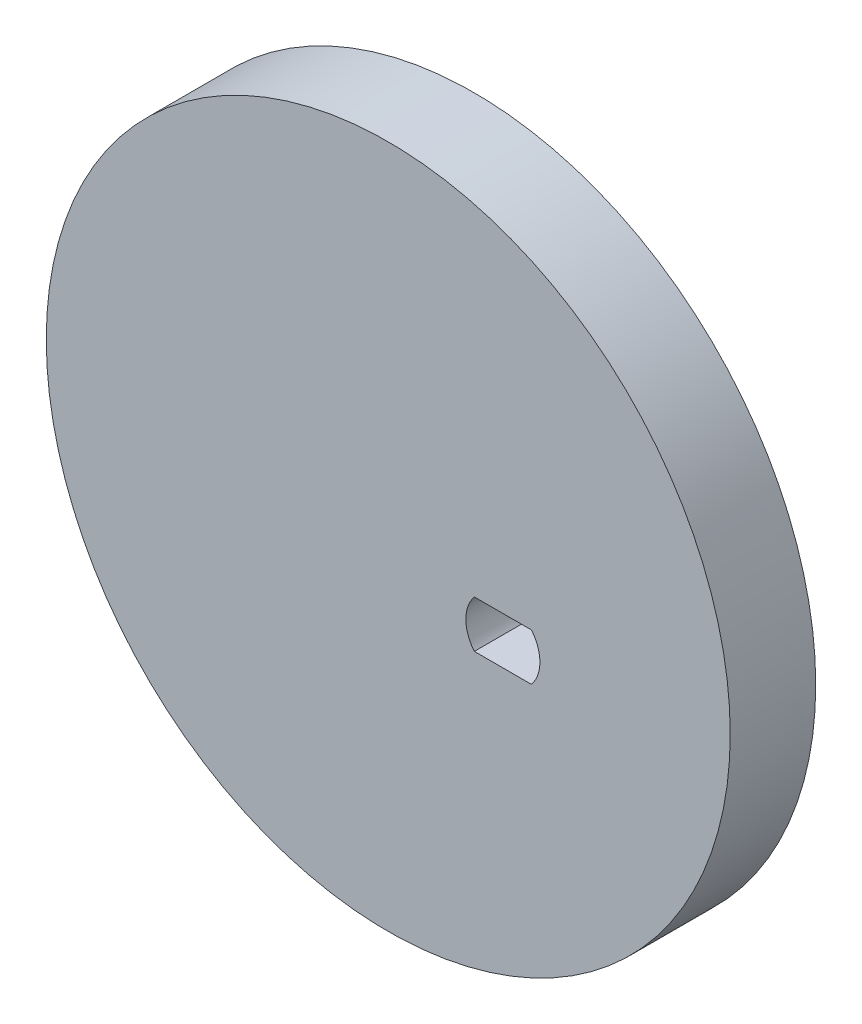
ISO-10303-21;
HEADER;
FILE_DESCRIPTION(('STEP AP214'),'2;1');
FILE_NAME('part.step','',(''),(''),'','','');
FILE_SCHEMA(('AUTOMOTIVE_DESIGN { 1 0 10303 214 1 1 1 1 }'));
ENDSEC;
DATA;
#1=APPLICATION_CONTEXT('core data for automotive mechanical design processes');
#2=APPLICATION_PROTOCOL_DEFINITION('international standard','automotive_design',2000,#1);
#3=PRODUCT_CONTEXT('',#1,'mechanical');
#4=PRODUCT('Part','Part','',(#3));
#5=PRODUCT_RELATED_PRODUCT_CATEGORY('part','',(#4));
#6=PRODUCT_DEFINITION_FORMATION('','',#4);
#7=PRODUCT_DEFINITION_CONTEXT('part definition',#1,'design');
#8=PRODUCT_DEFINITION('design','',#6,#7);
#9=PRODUCT_DEFINITION_SHAPE('','',#8);
#10=(LENGTH_UNIT() NAMED_UNIT(*) SI_UNIT(.MILLI.,.METRE.));
#11=(NAMED_UNIT(*) PLANE_ANGLE_UNIT() SI_UNIT($,.RADIAN.));
#12=(NAMED_UNIT(*) SI_UNIT($,.STERADIAN.) SOLID_ANGLE_UNIT());
#13=UNCERTAINTY_MEASURE_WITH_UNIT(LENGTH_MEASURE(1.E-05),#10,'distance_accuracy_value','');
#14=(GEOMETRIC_REPRESENTATION_CONTEXT(3) GLOBAL_UNCERTAINTY_ASSIGNED_CONTEXT((#13)) GLOBAL_UNIT_ASSIGNED_CONTEXT((#10,
#11,#12)) REPRESENTATION_CONTEXT('',''));
#15=CARTESIAN_POINT('',(0.,0.,0.));
#16=DIRECTION('',(0.,0.,1.));
#17=DIRECTION('',(1.,0.,0.));
#18=AXIS2_PLACEMENT_3D('',#15,#16,#17);
#19=CARTESIAN_POINT('',(-8.51465388188488,2.43047333481311,6.35));
#20=DIRECTION('',(0.,0.,1.));
#21=DIRECTION('',(1.,0.,0.));
#22=AXIS2_PLACEMENT_3D('',#19,#20,#21);
#23=PLANE('',#22);
#24=CARTESIAN_POINT('',(-8.51465388188488,2.43047333481311,6.35));
#25=DIRECTION('',(0.,0.,1.));
#26=DIRECTION('',(1.,0.,0.));
#27=AXIS2_PLACEMENT_3D('',#24,#25,#26);
#28=CIRCLE('',#27,25.4);
#29=CARTESIAN_POINT('',(16.8853461181151,2.43047333481311,6.35));
#30=VERTEX_POINT('',#29);
#31=EDGE_CURVE('E11',#30,#30,#28,.T.);
#32=ORIENTED_EDGE('',*,*,#31,.T.);
#33=EDGE_LOOP('',(#32));
#34=FACE_BOUND('',#33,.T.);
#35=DIRECTION('',(1.,0.,0.));
#36=VECTOR('',#35,1.);
#37=CARTESIAN_POINT('',(-2.12132034355964,-1.75,6.35));
#38=LINE('',#37,#36);
#39=CARTESIAN_POINT('',(-2.12132034355964,-1.75,6.35));
#40=VERTEX_POINT('',#39);
#41=CARTESIAN_POINT('',(2.12132034355964,-1.75,6.35));
#42=VERTEX_POINT('',#41);
#43=EDGE_CURVE('E87',#40,#42,#38,.T.);
#44=ORIENTED_EDGE('',*,*,#43,.F.);
#45=CARTESIAN_POINT('',(0.,0.,6.35));
#46=DIRECTION('',(0.,0.,1.));
#47=DIRECTION('',(1.,0.,0.));
#48=AXIS2_PLACEMENT_3D('',#45,#46,#47);
#49=CIRCLE('',#48,2.75);
#50=CARTESIAN_POINT('',(-2.12132034355964,1.75,6.35));
#51=VERTEX_POINT('',#50);
#52=EDGE_CURVE('E79',#51,#40,#49,.T.);
#53=ORIENTED_EDGE('',*,*,#52,.F.);
#54=DIRECTION('',(-1.,0.,0.));
#55=VECTOR('',#54,1.);
#56=CARTESIAN_POINT('',(-2.12132034355964,1.75,6.35));
#57=LINE('',#56,#55);
#58=CARTESIAN_POINT('',(2.12132034355964,1.75,6.35));
#59=VERTEX_POINT('',#58);
#60=EDGE_CURVE('E100',#59,#51,#57,.T.);
#61=ORIENTED_EDGE('',*,*,#60,.F.);
#62=CARTESIAN_POINT('',(0.,0.,6.35));
#63=DIRECTION('',(0.,0.,1.));
#64=DIRECTION('',(-1.,0.,0.));
#65=AXIS2_PLACEMENT_3D('',#62,#63,#64);
#66=CIRCLE('',#65,2.75);
#67=EDGE_CURVE('E98',#42,#59,#66,.T.);
#68=ORIENTED_EDGE('',*,*,#67,.F.);
#69=EDGE_LOOP('',(#44,#53,#61,#68));
#70=FACE_BOUND('',#69,.T.);
#71=ADVANCED_FACE('F38',(#34,#70),#23,.T.);
#72=CARTESIAN_POINT('',(-8.51465388188488,2.43047333481311,0.));
#73=DIRECTION('',(0.,0.,1.));
#74=DIRECTION('',(1.,0.,0.));
#75=AXIS2_PLACEMENT_3D('',#72,#73,#74);
#76=PLANE('',#75);
#77=CARTESIAN_POINT('',(-8.51465388188488,2.43047333481311,0.));
#78=DIRECTION('',(0.,0.,1.));
#79=DIRECTION('',(1.,0.,0.));
#80=AXIS2_PLACEMENT_3D('',#77,#78,#79);
#81=CIRCLE('',#80,25.4);
#82=CARTESIAN_POINT('',(16.8853461181151,2.43047333481311,0.));
#83=VERTEX_POINT('',#82);
#84=EDGE_CURVE('E42',#83,#83,#81,.T.);
#85=ORIENTED_EDGE('',*,*,#84,.F.);
#86=EDGE_LOOP('',(#85));
#87=FACE_BOUND('',#86,.T.);
#88=CARTESIAN_POINT('',(0.,0.,0.));
#89=DIRECTION('',(0.,0.,1.));
#90=DIRECTION('',(1.,0.,0.));
#91=AXIS2_PLACEMENT_3D('',#88,#89,#90);
#92=CIRCLE('',#91,2.75);
#93=CARTESIAN_POINT('',(-2.12132034355964,1.75,0.));
#94=VERTEX_POINT('',#93);
#95=CARTESIAN_POINT('',(-2.12132034355964,-1.75,0.));
#96=VERTEX_POINT('',#95);
#97=EDGE_CURVE('E61',#94,#96,#92,.T.);
#98=ORIENTED_EDGE('',*,*,#97,.T.);
#99=DIRECTION('',(1.,0.,0.));
#100=VECTOR('',#99,1.);
#101=CARTESIAN_POINT('',(-2.12132034355964,-1.75,0.));
#102=LINE('',#101,#100);
#103=CARTESIAN_POINT('',(2.12132034355964,-1.75,0.));
#104=VERTEX_POINT('',#103);
#105=EDGE_CURVE('E94',#96,#104,#102,.T.);
#106=ORIENTED_EDGE('',*,*,#105,.T.);
#107=CARTESIAN_POINT('',(0.,0.,0.));
#108=DIRECTION('',(0.,0.,1.));
#109=DIRECTION('',(-1.,0.,0.));
#110=AXIS2_PLACEMENT_3D('',#107,#108,#109);
#111=CIRCLE('',#110,2.75);
#112=CARTESIAN_POINT('',(2.12132034355964,1.75,0.));
#113=VERTEX_POINT('',#112);
#114=EDGE_CURVE('E106',#104,#113,#111,.T.);
#115=ORIENTED_EDGE('',*,*,#114,.T.);
#116=DIRECTION('',(-1.,0.,0.));
#117=VECTOR('',#116,1.);
#118=CARTESIAN_POINT('',(-2.12132034355964,1.75,0.));
#119=LINE('',#118,#117);
#120=EDGE_CURVE('E88',#113,#94,#119,.T.);
#121=ORIENTED_EDGE('',*,*,#120,.T.);
#122=EDGE_LOOP('',(#98,#106,#115,#121));
#123=FACE_BOUND('',#122,.T.);
#124=ADVANCED_FACE('F117',(#87,#123),#76,.F.);
#125=CARTESIAN_POINT('',(-8.51465388188488,2.43047333481311,6.35));
#126=DIRECTION('',(0.,0.,-1.));
#127=DIRECTION('',(-1.,0.,0.));
#128=AXIS2_PLACEMENT_3D('',#125,#126,#127);
#129=CYLINDRICAL_SURFACE('',#128,25.4);
#130=ORIENTED_EDGE('',*,*,#31,.F.);
#131=EDGE_LOOP('',(#130));
#132=FACE_BOUND('',#131,.T.);
#133=ORIENTED_EDGE('',*,*,#84,.T.);
#134=EDGE_LOOP('',(#133));
#135=FACE_BOUND('',#134,.T.);
#136=ADVANCED_FACE('F40',(#132,#135),#129,.T.);
#137=CARTESIAN_POINT('',(0.,0.,6.35));
#138=DIRECTION('',(0.,0.,-1.));
#139=DIRECTION('',(-1.,0.,0.));
#140=AXIS2_PLACEMENT_3D('',#137,#138,#139);
#141=CYLINDRICAL_SURFACE('',#140,2.75);
#142=ORIENTED_EDGE('',*,*,#97,.F.);
#143=DIRECTION('',(0.,0.,-1.));
#144=VECTOR('',#143,1.);
#145=CARTESIAN_POINT('',(-2.12132034355964,1.75,6.35));
#146=LINE('',#145,#144);
#147=EDGE_CURVE('E83',#51,#94,#146,.T.);
#148=ORIENTED_EDGE('',*,*,#147,.F.);
#149=ORIENTED_EDGE('',*,*,#52,.T.);
#150=DIRECTION('',(0.,0.,-1.));
#151=VECTOR('',#150,1.);
#152=CARTESIAN_POINT('',(-2.12132034355964,-1.75,6.35));
#153=LINE('',#152,#151);
#154=EDGE_CURVE('E82',#40,#96,#153,.T.);
#155=ORIENTED_EDGE('',*,*,#154,.T.);
#156=EDGE_LOOP('',(#142,#148,#149,#155));
#157=FACE_BOUND('',#156,.T.);
#158=ADVANCED_FACE('F81',(#157),#141,.F.);
#159=CARTESIAN_POINT('',(-2.12132034355964,-1.75,6.35));
#160=DIRECTION('',(0.,1.,0.));
#161=DIRECTION('',(0.,0.,1.));
#162=AXIS2_PLACEMENT_3D('',#159,#160,#161);
#163=PLANE('',#162);
#164=ORIENTED_EDGE('',*,*,#105,.F.);
#165=ORIENTED_EDGE('',*,*,#154,.F.);
#166=ORIENTED_EDGE('',*,*,#43,.T.);
#167=DIRECTION('',(0.,0.,-1.));
#168=VECTOR('',#167,1.);
#169=CARTESIAN_POINT('',(2.12132034355964,-1.75,6.35));
#170=LINE('',#169,#168);
#171=EDGE_CURVE('E95',#42,#104,#170,.T.);
#172=ORIENTED_EDGE('',*,*,#171,.T.);
#173=EDGE_LOOP('',(#164,#165,#166,#172));
#174=FACE_BOUND('',#173,.T.);
#175=ADVANCED_FACE('F91',(#174),#163,.T.);
#176=CARTESIAN_POINT('',(0.,0.,6.35));
#177=DIRECTION('',(0.,0.,-1.));
#178=DIRECTION('',(-1.,0.,0.));
#179=AXIS2_PLACEMENT_3D('',#176,#177,#178);
#180=CYLINDRICAL_SURFACE('',#179,2.75);
#181=ORIENTED_EDGE('',*,*,#114,.F.);
#182=ORIENTED_EDGE('',*,*,#171,.F.);
#183=ORIENTED_EDGE('',*,*,#67,.T.);
#184=DIRECTION('',(0.,0.,-1.));
#185=VECTOR('',#184,1.);
#186=CARTESIAN_POINT('',(2.12132034355964,1.75,6.35));
#187=LINE('',#186,#185);
#188=EDGE_CURVE('E53',#59,#113,#187,.T.);
#189=ORIENTED_EDGE('',*,*,#188,.T.);
#190=EDGE_LOOP('',(#181,#182,#183,#189));
#191=FACE_BOUND('',#190,.T.);
#192=ADVANCED_FACE('F115',(#191),#180,.F.);
#193=CARTESIAN_POINT('',(-2.12132034355964,1.75,6.35));
#194=DIRECTION('',(0.,-1.,0.));
#195=DIRECTION('',(0.,0.,-1.));
#196=AXIS2_PLACEMENT_3D('',#193,#194,#195);
#197=PLANE('',#196);
#198=ORIENTED_EDGE('',*,*,#120,.F.);
#199=ORIENTED_EDGE('',*,*,#188,.F.);
#200=ORIENTED_EDGE('',*,*,#60,.T.);
#201=ORIENTED_EDGE('',*,*,#147,.T.);
#202=EDGE_LOOP('',(#198,#199,#200,#201));
#203=FACE_BOUND('',#202,.T.);
#204=ADVANCED_FACE('F118',(#203),#197,.T.);
#205=CLOSED_SHELL('',(#71,#124,#136,#158,#175,#192,#204));
#206=MANIFOLD_SOLID_BREP('B2',#205);
#207=ADVANCED_BREP_SHAPE_REPRESENTATION('',(#18,#206),#14);
#208=SHAPE_DEFINITION_REPRESENTATION(#9,#207);
ENDSEC;
END-ISO-10303-21;
